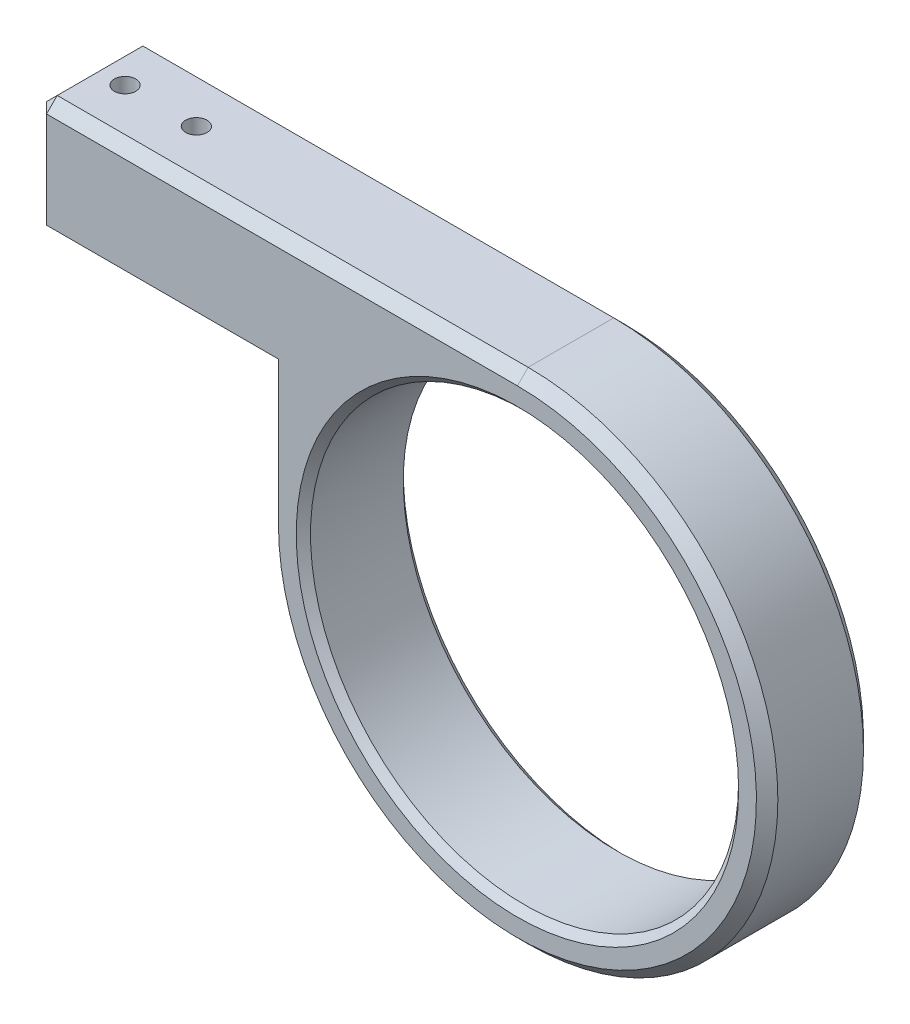
ISO-10303-21;
HEADER;
FILE_DESCRIPTION(('STEP AP214'),'2;1');
FILE_NAME('part.step','',(''),(''),'','','');
FILE_SCHEMA(('AUTOMOTIVE_DESIGN { 1 0 10303 214 1 1 1 1 }'));
ENDSEC;
DATA;
#1=APPLICATION_CONTEXT('core data for automotive mechanical design processes');
#2=APPLICATION_PROTOCOL_DEFINITION('international standard','automotive_design',2000,#1);
#3=PRODUCT_CONTEXT('',#1,'mechanical');
#4=PRODUCT('Part','Part','',(#3));
#5=PRODUCT_RELATED_PRODUCT_CATEGORY('part','',(#4));
#6=PRODUCT_DEFINITION_FORMATION('','',#4);
#7=PRODUCT_DEFINITION_CONTEXT('part definition',#1,'design');
#8=PRODUCT_DEFINITION('design','',#6,#7);
#9=PRODUCT_DEFINITION_SHAPE('','',#8);
#10=(LENGTH_UNIT() NAMED_UNIT(*) SI_UNIT(.MILLI.,.METRE.));
#11=(NAMED_UNIT(*) PLANE_ANGLE_UNIT() SI_UNIT($,.RADIAN.));
#12=(NAMED_UNIT(*) SI_UNIT($,.STERADIAN.) SOLID_ANGLE_UNIT());
#13=UNCERTAINTY_MEASURE_WITH_UNIT(LENGTH_MEASURE(1.E-05),#10,'distance_accuracy_value','');
#14=(GEOMETRIC_REPRESENTATION_CONTEXT(3) GLOBAL_UNCERTAINTY_ASSIGNED_CONTEXT((#13)) GLOBAL_UNIT_ASSIGNED_CONTEXT((#10,
#11,#12)) REPRESENTATION_CONTEXT('',''));
#15=CARTESIAN_POINT('',(0.,0.,0.));
#16=DIRECTION('',(0.,0.,1.));
#17=DIRECTION('',(1.,0.,0.));
#18=AXIS2_PLACEMENT_3D('',#15,#16,#17);
#19=CARTESIAN_POINT('',(0.,0.,15.));
#20=DIRECTION('',(0.,0.,-1.));
#21=DIRECTION('',(-1.,0.,0.));
#22=AXIS2_PLACEMENT_3D('',#19,#20,#21);
#23=CYLINDRICAL_SURFACE('',#22,35.);
#24=DIRECTION('',(0.,0.,1.));
#25=VECTOR('',#24,1.);
#26=CARTESIAN_POINT('',(-35.,0.,15.));
#27=LINE('',#26,#25);
#28=CARTESIAN_POINT('',(-35.,0.,1.49999999999999));
#29=VERTEX_POINT('',#28);
#30=CARTESIAN_POINT('',(-35.,0.,13.5));
#31=VERTEX_POINT('',#30);
#32=EDGE_CURVE('E255',#29,#31,#27,.T.);
#33=ORIENTED_EDGE('',*,*,#32,.F.);
#34=CARTESIAN_POINT('',(0.,0.,1.49999999999999));
#35=DIRECTION('',(0.,0.,1.));
#36=DIRECTION('',(1.,0.,0.));
#37=AXIS2_PLACEMENT_3D('',#34,#35,#36);
#38=CIRCLE('',#37,35.);
#39=CARTESIAN_POINT('',(0.,35.,1.49999999999999));
#40=VERTEX_POINT('',#39);
#41=EDGE_CURVE('E193',#29,#40,#38,.T.);
#42=ORIENTED_EDGE('',*,*,#41,.T.);
#43=DIRECTION('',(0.,0.,-1.));
#44=VECTOR('',#43,1.);
#45=CARTESIAN_POINT('',(0.,35.,15.));
#46=LINE('',#45,#44);
#47=CARTESIAN_POINT('',(0.,35.,13.5));
#48=VERTEX_POINT('',#47);
#49=EDGE_CURVE('E262',#40,#48,#46,.F.);
#50=ORIENTED_EDGE('',*,*,#49,.T.);
#51=CARTESIAN_POINT('',(0.,0.,13.5));
#52=DIRECTION('',(0.,0.,1.));
#53=DIRECTION('',(1.,0.,0.));
#54=AXIS2_PLACEMENT_3D('',#51,#52,#53);
#55=CIRCLE('',#54,35.);
#56=EDGE_CURVE('E56',#48,#31,#55,.F.);
#57=ORIENTED_EDGE('',*,*,#56,.T.);
#58=EDGE_LOOP('',(#33,#42,#50,#57));
#59=FACE_BOUND('',#58,.T.);
#60=ADVANCED_FACE('F38',(#59),#23,.T.);
#61=CARTESIAN_POINT('',(0.,0.,15.));
#62=DIRECTION('',(0.,0.,1.));
#63=DIRECTION('',(1.,0.,0.));
#64=AXIS2_PLACEMENT_3D('',#61,#62,#63);
#65=PLANE('',#64);
#66=CARTESIAN_POINT('',(0.,0.,15.));
#67=DIRECTION('',(0.,0.,1.));
#68=DIRECTION('',(1.,0.,0.));
#69=AXIS2_PLACEMENT_3D('',#66,#67,#68);
#70=CIRCLE('',#69,31.);
#71=CARTESIAN_POINT('',(31.,0.,15.));
#72=VERTEX_POINT('',#71);
#73=EDGE_CURVE('E267',#72,#72,#70,.F.);
#74=ORIENTED_EDGE('',*,*,#73,.T.);
#75=EDGE_LOOP('',(#74));
#76=FACE_BOUND('',#75,.T.);
#77=DIRECTION('',(-1.,0.,0.));
#78=VECTOR('',#77,1.);
#79=CARTESIAN_POINT('',(0.,33.5,15.));
#80=LINE('',#79,#78);
#81=CARTESIAN_POINT('',(0.,33.5,15.));
#82=VERTEX_POINT('',#81);
#83=CARTESIAN_POINT('',(-66.,33.5,15.));
#84=VERTEX_POINT('',#83);
#85=EDGE_CURVE('E290',#82,#84,#80,.T.);
#86=ORIENTED_EDGE('',*,*,#85,.T.);
#87=DIRECTION('',(0.,-1.,0.));
#88=VECTOR('',#87,1.);
#89=CARTESIAN_POINT('',(-66.,0.,15.));
#90=LINE('',#89,#88);
#91=CARTESIAN_POINT('',(-66.,20.,15.));
#92=VERTEX_POINT('',#91);
#93=EDGE_CURVE('E156',#84,#92,#90,.T.);
#94=ORIENTED_EDGE('',*,*,#93,.T.);
#95=DIRECTION('',(-1.,0.,0.));
#96=VECTOR('',#95,1.);
#97=CARTESIAN_POINT('',(35.001,20.,15.));
#98=LINE('',#97,#96);
#99=CARTESIAN_POINT('',(-33.5,20.,15.));
#100=VERTEX_POINT('',#99);
#101=EDGE_CURVE('E259',#100,#92,#98,.T.);
#102=ORIENTED_EDGE('',*,*,#101,.F.);
#103=DIRECTION('',(0.,-1.,0.));
#104=VECTOR('',#103,1.);
#105=CARTESIAN_POINT('',(-33.5,0.,15.));
#106=LINE('',#105,#104);
#107=CARTESIAN_POINT('',(-33.5,0.,15.));
#108=VERTEX_POINT('',#107);
#109=EDGE_CURVE('E162',#100,#108,#106,.T.);
#110=ORIENTED_EDGE('',*,*,#109,.T.);
#111=CARTESIAN_POINT('',(0.,0.,15.));
#112=DIRECTION('',(0.,0.,1.));
#113=DIRECTION('',(1.,0.,0.));
#114=AXIS2_PLACEMENT_3D('',#111,#112,#113);
#115=CIRCLE('',#114,33.5);
#116=EDGE_CURVE('E287',#108,#82,#115,.T.);
#117=ORIENTED_EDGE('',*,*,#116,.T.);
#118=EDGE_LOOP('',(#86,#94,#102,#110,#117));
#119=FACE_BOUND('',#118,.T.);
#120=ADVANCED_FACE('F296',(#76,#119),#65,.T.);
#121=CARTESIAN_POINT('',(0.,0.,0.));
#122=DIRECTION('',(0.,0.,1.));
#123=DIRECTION('',(1.,0.,0.));
#124=AXIS2_PLACEMENT_3D('',#121,#122,#123);
#125=PLANE('',#124);
#126=CARTESIAN_POINT('',(0.,0.,0.));
#127=DIRECTION('',(0.,0.,1.));
#128=DIRECTION('',(1.,0.,0.));
#129=AXIS2_PLACEMENT_3D('',#126,#127,#128);
#130=CIRCLE('',#129,31.);
#131=CARTESIAN_POINT('',(31.,0.,0.));
#132=VERTEX_POINT('',#131);
#133=EDGE_CURVE('E139',#132,#132,#130,.T.);
#134=ORIENTED_EDGE('',*,*,#133,.T.);
#135=EDGE_LOOP('',(#134));
#136=FACE_BOUND('',#135,.T.);
#137=DIRECTION('',(0.,1.,0.));
#138=VECTOR('',#137,1.);
#139=CARTESIAN_POINT('',(-33.5,20.,0.));
#140=LINE('',#139,#138);
#141=CARTESIAN_POINT('',(-33.5,0.,0.));
#142=VERTEX_POINT('',#141);
#143=CARTESIAN_POINT('',(-33.5,20.,0.));
#144=VERTEX_POINT('',#143);
#145=EDGE_CURVE('E180',#142,#144,#140,.T.);
#146=ORIENTED_EDGE('',*,*,#145,.T.);
#147=DIRECTION('',(-1.,0.,0.));
#148=VECTOR('',#147,1.);
#149=CARTESIAN_POINT('',(35.001,20.,0.));
#150=LINE('',#149,#148);
#151=CARTESIAN_POINT('',(-66.,20.,0.));
#152=VERTEX_POINT('',#151);
#153=EDGE_CURVE('E149',#144,#152,#150,.T.);
#154=ORIENTED_EDGE('',*,*,#153,.T.);
#155=DIRECTION('',(0.,1.,0.));
#156=VECTOR('',#155,1.);
#157=CARTESIAN_POINT('',(-66.,35.,0.));
#158=LINE('',#157,#156);
#159=CARTESIAN_POINT('',(-66.,33.5,0.));
#160=VERTEX_POINT('',#159);
#161=EDGE_CURVE('E154',#152,#160,#158,.T.);
#162=ORIENTED_EDGE('',*,*,#161,.T.);
#163=DIRECTION('',(1.,0.,0.));
#164=VECTOR('',#163,1.);
#165=CARTESIAN_POINT('',(0.,33.5,0.));
#166=LINE('',#165,#164);
#167=CARTESIAN_POINT('',(0.,33.5,0.));
#168=VERTEX_POINT('',#167);
#169=EDGE_CURVE('E177',#160,#168,#166,.T.);
#170=ORIENTED_EDGE('',*,*,#169,.T.);
#171=CARTESIAN_POINT('',(0.,0.,0.));
#172=DIRECTION('',(0.,0.,1.));
#173=DIRECTION('',(1.,0.,0.));
#174=AXIS2_PLACEMENT_3D('',#171,#172,#173);
#175=CIRCLE('',#174,33.5);
#176=EDGE_CURVE('E174',#168,#142,#175,.F.);
#177=ORIENTED_EDGE('',*,*,#176,.T.);
#178=EDGE_LOOP('',(#146,#154,#162,#170,#177));
#179=FACE_BOUND('',#178,.T.);
#180=ADVANCED_FACE('F327',(#136,#179),#125,.F.);
#181=CARTESIAN_POINT('',(0.,0.,15.));
#182=DIRECTION('',(0.,0.,-1.));
#183=DIRECTION('',(-1.,0.,0.));
#184=AXIS2_PLACEMENT_3D('',#181,#182,#183);
#185=CYLINDRICAL_SURFACE('',#184,30.);
#186=CARTESIAN_POINT('',(0.,0.,14.));
#187=DIRECTION('',(0.,0.,1.));
#188=DIRECTION('',(1.,0.,0.));
#189=AXIS2_PLACEMENT_3D('',#186,#187,#188);
#190=CIRCLE('',#189,30.);
#191=CARTESIAN_POINT('',(30.,0.,14.));
#192=VERTEX_POINT('',#191);
#193=EDGE_CURVE('E275',#192,#192,#190,.T.);
#194=ORIENTED_EDGE('',*,*,#193,.T.);
#195=EDGE_LOOP('',(#194));
#196=FACE_BOUND('',#195,.T.);
#197=CARTESIAN_POINT('',(0.,0.,0.999999999999997));
#198=DIRECTION('',(0.,0.,1.));
#199=DIRECTION('',(1.,0.,0.));
#200=AXIS2_PLACEMENT_3D('',#197,#198,#199);
#201=CIRCLE('',#200,30.);
#202=CARTESIAN_POINT('',(30.,0.,0.999999999999997));
#203=VERTEX_POINT('',#202);
#204=EDGE_CURVE('E271',#203,#203,#201,.F.);
#205=ORIENTED_EDGE('',*,*,#204,.T.);
#206=EDGE_LOOP('',(#205));
#207=FACE_BOUND('',#206,.T.);
#208=ADVANCED_FACE('F342',(#196,#207),#185,.F.);
#209=CARTESIAN_POINT('',(35.001,20.,15.));
#210=DIRECTION('',(0.,-1.,0.));
#211=DIRECTION('',(0.,0.,-1.));
#212=AXIS2_PLACEMENT_3D('',#209,#210,#211);
#213=PLANE('',#212);
#214=CARTESIAN_POINT('',(-62.5,20.,7.5));
#215=DIRECTION('',(0.,-1.,0.));
#216=DIRECTION('',(0.,0.,-1.));
#217=AXIS2_PLACEMENT_3D('',#214,#215,#216);
#218=CIRCLE('',#217,1.5);
#219=CARTESIAN_POINT('',(-62.5,20.,5.99999999999999));
#220=VERTEX_POINT('',#219);
#221=EDGE_CURVE('E249',#220,#220,#218,.T.);
#222=ORIENTED_EDGE('',*,*,#221,.F.);
#223=EDGE_LOOP('',(#222));
#224=FACE_BOUND('',#223,.T.);
#225=CARTESIAN_POINT('',(-52.5,20.,7.5));
#226=DIRECTION('',(0.,-1.,0.));
#227=DIRECTION('',(0.,0.,-1.));
#228=AXIS2_PLACEMENT_3D('',#225,#226,#227);
#229=CIRCLE('',#228,1.5);
#230=CARTESIAN_POINT('',(-52.5,20.,5.99999999999999));
#231=VERTEX_POINT('',#230);
#232=EDGE_CURVE('E236',#231,#231,#229,.T.);
#233=ORIENTED_EDGE('',*,*,#232,.F.);
#234=EDGE_LOOP('',(#233));
#235=FACE_BOUND('',#234,.T.);
#236=ORIENTED_EDGE('',*,*,#101,.T.);
#237=DIRECTION('',(0.707106781186548,0.,0.707106781186548));
#238=VECTOR('',#237,1.);
#239=CARTESIAN_POINT('',(-15.4995,20.,65.5005));
#240=LINE('',#239,#238);
#241=CARTESIAN_POINT('',(-67.5,20.,13.5));
#242=VERTEX_POINT('',#241);
#243=EDGE_CURVE('E147',#92,#242,#240,.F.);
#244=ORIENTED_EDGE('',*,*,#243,.T.);
#245=DIRECTION('',(0.,0.,1.));
#246=VECTOR('',#245,1.);
#247=CARTESIAN_POINT('',(-67.5,20.,15.));
#248=LINE('',#247,#246);
#249=CARTESIAN_POINT('',(-67.5,20.,1.5));
#250=VERTEX_POINT('',#249);
#251=EDGE_CURVE('E130',#250,#242,#248,.T.);
#252=ORIENTED_EDGE('',*,*,#251,.F.);
#253=DIRECTION('',(0.707106781186548,0.,-0.707106781186548));
#254=VECTOR('',#253,1.);
#255=CARTESIAN_POINT('',(-22.9995,20.,-43.0005));
#256=LINE('',#255,#254);
#257=EDGE_CURVE('E144',#250,#152,#256,.T.);
#258=ORIENTED_EDGE('',*,*,#257,.T.);
#259=ORIENTED_EDGE('',*,*,#153,.F.);
#260=DIRECTION('',(-0.707106781186549,0.,0.707106781186546));
#261=VECTOR('',#260,1.);
#262=CARTESIAN_POINT('',(-35.,20.,1.49999999999998));
#263=LINE('',#262,#261);
#264=CARTESIAN_POINT('',(-35.,20.,1.49999999999999));
#265=VERTEX_POINT('',#264);
#266=EDGE_CURVE('E48',#144,#265,#263,.T.);
#267=ORIENTED_EDGE('',*,*,#266,.T.);
#268=DIRECTION('',(0.,0.,-1.));
#269=VECTOR('',#268,1.);
#270=CARTESIAN_POINT('',(-35.,20.,15.));
#271=LINE('',#270,#269);
#272=CARTESIAN_POINT('',(-35.,20.,13.5));
#273=VERTEX_POINT('',#272);
#274=EDGE_CURVE('E150',#273,#265,#271,.T.);
#275=ORIENTED_EDGE('',*,*,#274,.F.);
#276=DIRECTION('',(-0.707106781186546,0.,-0.707106781186549));
#277=VECTOR('',#276,1.);
#278=CARTESIAN_POINT('',(-35.,20.,13.5));
#279=LINE('',#278,#277);
#280=EDGE_CURVE('E11',#273,#100,#279,.F.);
#281=ORIENTED_EDGE('',*,*,#280,.T.);
#282=EDGE_LOOP('',(#236,#244,#252,#258,#259,#267,#275,#281));
#283=FACE_BOUND('',#282,.T.);
#284=ADVANCED_FACE('F143',(#224,#235,#283),#213,.T.);
#285=CARTESIAN_POINT('',(35.001,35.,15.));
#286=DIRECTION('',(0.,1.,0.));
#287=DIRECTION('',(0.,0.,1.));
#288=AXIS2_PLACEMENT_3D('',#285,#286,#287);
#289=PLANE('',#288);
#290=CARTESIAN_POINT('',(-62.5,35.,7.49999999999999));
#291=DIRECTION('',(0.,-1.,0.));
#292=DIRECTION('',(0.,0.,-1.));
#293=AXIS2_PLACEMENT_3D('',#290,#291,#292);
#294=CIRCLE('',#293,1.5);
#295=CARTESIAN_POINT('',(-62.5,35.,5.99999999999999));
#296=VERTEX_POINT('',#295);
#297=EDGE_CURVE('E257',#296,#296,#294,.T.);
#298=ORIENTED_EDGE('',*,*,#297,.T.);
#299=EDGE_LOOP('',(#298));
#300=FACE_BOUND('',#299,.T.);
#301=CARTESIAN_POINT('',(-52.5,35.,7.49999999999999));
#302=DIRECTION('',(0.,-1.,0.));
#303=DIRECTION('',(0.,0.,-1.));
#304=AXIS2_PLACEMENT_3D('',#301,#302,#303);
#305=CIRCLE('',#304,1.5);
#306=CARTESIAN_POINT('',(-52.5,35.,5.99999999999999));
#307=VERTEX_POINT('',#306);
#308=EDGE_CURVE('E243',#307,#307,#305,.T.);
#309=ORIENTED_EDGE('',*,*,#308,.T.);
#310=EDGE_LOOP('',(#309));
#311=FACE_BOUND('',#310,.T.);
#312=ORIENTED_EDGE('',*,*,#49,.F.);
#313=DIRECTION('',(-1.,0.,0.));
#314=VECTOR('',#313,1.);
#315=CARTESIAN_POINT('',(-67.5,35.,1.49999999999999));
#316=LINE('',#315,#314);
#317=CARTESIAN_POINT('',(-66.,35.,1.49999999999999));
#318=VERTEX_POINT('',#317);
#319=EDGE_CURVE('E171',#40,#318,#316,.T.);
#320=ORIENTED_EDGE('',*,*,#319,.T.);
#321=DIRECTION('',(0.,0.,1.));
#322=VECTOR('',#321,1.);
#323=CARTESIAN_POINT('',(-66.,35.,15.));
#324=LINE('',#323,#322);
#325=CARTESIAN_POINT('',(-66.,35.,13.5));
#326=VERTEX_POINT('',#325);
#327=EDGE_CURVE('E168',#318,#326,#324,.T.);
#328=ORIENTED_EDGE('',*,*,#327,.T.);
#329=DIRECTION('',(1.,0.,0.));
#330=VECTOR('',#329,1.);
#331=CARTESIAN_POINT('',(35.001,35.,13.5));
#332=LINE('',#331,#330);
#333=EDGE_CURVE('E160',#326,#48,#332,.T.);
#334=ORIENTED_EDGE('',*,*,#333,.T.);
#335=EDGE_LOOP('',(#312,#320,#328,#334));
#336=FACE_BOUND('',#335,.T.);
#337=ADVANCED_FACE('F332',(#300,#311,#336),#289,.T.);
#338=CARTESIAN_POINT('',(-67.5,0.,0.));
#339=DIRECTION('',(-1.,0.,0.));
#340=DIRECTION('',(0.,0.,1.));
#341=AXIS2_PLACEMENT_3D('',#338,#339,#340);
#342=PLANE('',#341);
#343=ORIENTED_EDGE('',*,*,#251,.T.);
#344=DIRECTION('',(0.,1.,0.));
#345=VECTOR('',#344,1.);
#346=CARTESIAN_POINT('',(-67.5,0.,13.5));
#347=LINE('',#346,#345);
#348=CARTESIAN_POINT('',(-67.5,33.5,13.5));
#349=VERTEX_POINT('',#348);
#350=EDGE_CURVE('E284',#242,#349,#347,.T.);
#351=ORIENTED_EDGE('',*,*,#350,.T.);
#352=DIRECTION('',(0.,0.,-1.));
#353=VECTOR('',#352,1.);
#354=CARTESIAN_POINT('',(-67.5,33.5,0.));
#355=LINE('',#354,#353);
#356=CARTESIAN_POINT('',(-67.5,33.5,1.5));
#357=VERTEX_POINT('',#356);
#358=EDGE_CURVE('E133',#349,#357,#355,.T.);
#359=ORIENTED_EDGE('',*,*,#358,.T.);
#360=DIRECTION('',(0.,-1.,0.));
#361=VECTOR('',#360,1.);
#362=CARTESIAN_POINT('',(-67.5,20.,1.5));
#363=LINE('',#362,#361);
#364=EDGE_CURVE('E126',#357,#250,#363,.T.);
#365=ORIENTED_EDGE('',*,*,#364,.T.);
#366=EDGE_LOOP('',(#343,#351,#359,#365));
#367=FACE_BOUND('',#366,.T.);
#368=ADVANCED_FACE('F128',(#367),#342,.T.);
#369=CARTESIAN_POINT('',(-35.,0.,0.));
#370=DIRECTION('',(-1.,0.,0.));
#371=DIRECTION('',(0.,0.,1.));
#372=AXIS2_PLACEMENT_3D('',#369,#370,#371);
#373=PLANE('',#372);
#374=ORIENTED_EDGE('',*,*,#274,.T.);
#375=DIRECTION('',(0.,-1.,0.));
#376=VECTOR('',#375,1.);
#377=CARTESIAN_POINT('',(-35.,0.,1.49999999999999));
#378=LINE('',#377,#376);
#379=EDGE_CURVE('E63',#265,#29,#378,.T.);
#380=ORIENTED_EDGE('',*,*,#379,.T.);
#381=ORIENTED_EDGE('',*,*,#32,.T.);
#382=DIRECTION('',(0.,1.,0.));
#383=VECTOR('',#382,1.);
#384=CARTESIAN_POINT('',(-35.,0.,13.5));
#385=LINE('',#384,#383);
#386=EDGE_CURVE('E186',#31,#273,#385,.T.);
#387=ORIENTED_EDGE('',*,*,#386,.T.);
#388=EDGE_LOOP('',(#374,#380,#381,#387));
#389=FACE_BOUND('',#388,.T.);
#390=ADVANCED_FACE('F340',(#389),#373,.T.);
#391=CARTESIAN_POINT('',(-52.5,35.,7.49999999999999));
#392=DIRECTION('',(0.,-1.,0.));
#393=DIRECTION('',(0.,0.,-1.));
#394=AXIS2_PLACEMENT_3D('',#391,#392,#393);
#395=CYLINDRICAL_SURFACE('',#394,1.5);
#396=ORIENTED_EDGE('',*,*,#308,.F.);
#397=EDGE_LOOP('',(#396));
#398=FACE_BOUND('',#397,.T.);
#399=ORIENTED_EDGE('',*,*,#232,.T.);
#400=EDGE_LOOP('',(#399));
#401=FACE_BOUND('',#400,.T.);
#402=ADVANCED_FACE('F392',(#398,#401),#395,.F.);
#403=CARTESIAN_POINT('',(-62.5,35.,7.49999999999999));
#404=DIRECTION('',(0.,-1.,0.));
#405=DIRECTION('',(0.,0.,-1.));
#406=AXIS2_PLACEMENT_3D('',#403,#404,#405);
#407=CYLINDRICAL_SURFACE('',#406,1.5);
#408=ORIENTED_EDGE('',*,*,#297,.F.);
#409=EDGE_LOOP('',(#408));
#410=FACE_BOUND('',#409,.T.);
#411=ORIENTED_EDGE('',*,*,#221,.T.);
#412=EDGE_LOOP('',(#411));
#413=FACE_BOUND('',#412,.T.);
#414=ADVANCED_FACE('F361',(#410,#413),#407,.F.);
#415=CARTESIAN_POINT('',(0.,0.,15.));
#416=DIRECTION('',(0.,0.,1.));
#417=DIRECTION('',(1.,0.,0.));
#418=AXIS2_PLACEMENT_3D('',#415,#416,#417);
#419=CONICAL_SURFACE('',#418,31.,0.785398163397447);
#420=ORIENTED_EDGE('',*,*,#193,.F.);
#421=EDGE_LOOP('',(#420));
#422=FACE_BOUND('',#421,.T.);
#423=ORIENTED_EDGE('',*,*,#73,.F.);
#424=EDGE_LOOP('',(#423));
#425=FACE_BOUND('',#424,.T.);
#426=ADVANCED_FACE('F357',(#422,#425),#419,.F.);
#427=CARTESIAN_POINT('',(0.,0.,0.999999999999997));
#428=DIRECTION('',(0.,0.,-1.));
#429=DIRECTION('',(-1.,0.,0.));
#430=AXIS2_PLACEMENT_3D('',#427,#428,#429);
#431=CONICAL_SURFACE('',#430,30.,0.785398163397445);
#432=ORIENTED_EDGE('',*,*,#133,.F.);
#433=EDGE_LOOP('',(#432));
#434=FACE_BOUND('',#433,.T.);
#435=ORIENTED_EDGE('',*,*,#204,.F.);
#436=EDGE_LOOP('',(#435));
#437=FACE_BOUND('',#436,.T.);
#438=ADVANCED_FACE('F360',(#434,#437),#431,.F.);
#439=CARTESIAN_POINT('',(-35.,0.,1.49999999999999));
#440=DIRECTION('',(-0.707106781186546,0.,-0.707106781186549));
#441=DIRECTION('',(0.,1.,0.));
#442=AXIS2_PLACEMENT_3D('',#439,#440,#441);
#443=PLANE('',#442);
#444=ORIENTED_EDGE('',*,*,#266,.F.);
#445=ORIENTED_EDGE('',*,*,#145,.F.);
#446=DIRECTION('',(0.707106781186549,0.,-0.707106781186546));
#447=VECTOR('',#446,1.);
#448=CARTESIAN_POINT('',(-35.,0.,1.49999999999999));
#449=LINE('',#448,#447);
#450=EDGE_CURVE('E42',#29,#142,#449,.T.);
#451=ORIENTED_EDGE('',*,*,#450,.F.);
#452=ORIENTED_EDGE('',*,*,#379,.F.);
#453=EDGE_LOOP('',(#444,#445,#451,#452));
#454=FACE_BOUND('',#453,.T.);
#455=ADVANCED_FACE('F40',(#454),#443,.T.);
#456=CARTESIAN_POINT('',(0.,0.,1.49999999999999));
#457=DIRECTION('',(0.,0.,1.));
#458=DIRECTION('',(1.,0.,0.));
#459=AXIS2_PLACEMENT_3D('',#456,#457,#458);
#460=CONICAL_SURFACE('',#459,35.,0.785398163397451);
#461=ORIENTED_EDGE('',*,*,#450,.T.);
#462=ORIENTED_EDGE('',*,*,#176,.F.);
#463=DIRECTION('',(0.,-0.707106781186549,-0.707106781186546));
#464=VECTOR('',#463,1.);
#465=CARTESIAN_POINT('',(0.,35.,1.49999999999999));
#466=LINE('',#465,#464);
#467=EDGE_CURVE('E227',#40,#168,#466,.T.);
#468=ORIENTED_EDGE('',*,*,#467,.F.);
#469=ORIENTED_EDGE('',*,*,#41,.F.);
#470=EDGE_LOOP('',(#461,#462,#468,#469));
#471=FACE_BOUND('',#470,.T.);
#472=ADVANCED_FACE('F329',(#471),#460,.T.);
#473=CARTESIAN_POINT('',(-67.5,0.,1.5));
#474=DIRECTION('',(-0.707106781186547,0.,-0.707106781186547));
#475=DIRECTION('',(0.,1.,0.));
#476=AXIS2_PLACEMENT_3D('',#473,#474,#475);
#477=PLANE('',#476);
#478=ORIENTED_EDGE('',*,*,#257,.F.);
#479=ORIENTED_EDGE('',*,*,#364,.F.);
#480=DIRECTION('',(-0.707106781186548,0.,0.707106781186548));
#481=VECTOR('',#480,1.);
#482=CARTESIAN_POINT('',(-67.5,33.5,1.5));
#483=LINE('',#482,#481);
#484=EDGE_CURVE('E225',#160,#357,#483,.T.);
#485=ORIENTED_EDGE('',*,*,#484,.F.);
#486=ORIENTED_EDGE('',*,*,#161,.F.);
#487=EDGE_LOOP('',(#478,#479,#485,#486));
#488=FACE_BOUND('',#487,.T.);
#489=ADVANCED_FACE('F153',(#488),#477,.T.);
#490=CARTESIAN_POINT('',(35.001,35.,1.49999999999999));
#491=DIRECTION('',(0.,0.707106781186546,-0.707106781186549));
#492=DIRECTION('',(1.,0.,0.));
#493=AXIS2_PLACEMENT_3D('',#490,#491,#492);
#494=PLANE('',#493);
#495=ORIENTED_EDGE('',*,*,#467,.T.);
#496=ORIENTED_EDGE('',*,*,#169,.F.);
#497=DIRECTION('',(0.,-0.707106781186549,-0.707106781186546));
#498=VECTOR('',#497,1.);
#499=CARTESIAN_POINT('',(-66.,34.25,0.749999999999994));
#500=LINE('',#499,#498);
#501=EDGE_CURVE('E221',#318,#160,#500,.T.);
#502=ORIENTED_EDGE('',*,*,#501,.F.);
#503=ORIENTED_EDGE('',*,*,#319,.F.);
#504=EDGE_LOOP('',(#495,#496,#502,#503));
#505=FACE_BOUND('',#504,.T.);
#506=ADVANCED_FACE('F325',(#505),#494,.T.);
#507=CARTESIAN_POINT('',(-35.,0.,13.5));
#508=DIRECTION('',(0.707106781186549,0.,-0.707106781186546));
#509=DIRECTION('',(0.,1.,0.));
#510=AXIS2_PLACEMENT_3D('',#507,#508,#509);
#511=PLANE('',#510);
#512=ORIENTED_EDGE('',*,*,#280,.F.);
#513=ORIENTED_EDGE('',*,*,#386,.F.);
#514=DIRECTION('',(-0.707106781186546,0.,-0.707106781186549));
#515=VECTOR('',#514,1.);
#516=CARTESIAN_POINT('',(-33.5,0.,15.));
#517=LINE('',#516,#515);
#518=EDGE_CURVE('E217',#108,#31,#517,.T.);
#519=ORIENTED_EDGE('',*,*,#518,.F.);
#520=ORIENTED_EDGE('',*,*,#109,.F.);
#521=EDGE_LOOP('',(#512,#513,#519,#520));
#522=FACE_BOUND('',#521,.T.);
#523=ADVANCED_FACE('F302',(#522),#511,.F.);
#524=CARTESIAN_POINT('',(-67.5,33.5,1.5));
#525=DIRECTION('',(-0.577350269189628,0.577350269189623,-0.577350269189626));
#526=DIRECTION('',(-0.707106781186546,0.,0.707106781186549));
#527=AXIS2_PLACEMENT_3D('',#524,#525,#526);
#528=PLANE('',#527);
#529=ORIENTED_EDGE('',*,*,#501,.T.);
#530=ORIENTED_EDGE('',*,*,#484,.T.);
#531=DIRECTION('',(-0.707106781186547,-0.707106781186547,0.));
#532=VECTOR('',#531,1.);
#533=CARTESIAN_POINT('',(-67.5,33.5,1.5));
#534=LINE('',#533,#532);
#535=EDGE_CURVE('E213',#318,#357,#534,.T.);
#536=ORIENTED_EDGE('',*,*,#535,.F.);
#537=EDGE_LOOP('',(#529,#530,#536));
#538=FACE_BOUND('',#537,.T.);
#539=ADVANCED_FACE('F323',(#538),#528,.T.);
#540=CARTESIAN_POINT('',(0.,0.,15.));
#541=DIRECTION('',(0.,0.,-1.));
#542=DIRECTION('',(-1.,0.,0.));
#543=AXIS2_PLACEMENT_3D('',#540,#541,#542);
#544=CONICAL_SURFACE('',#543,33.5,0.785398163397446);
#545=ORIENTED_EDGE('',*,*,#518,.T.);
#546=ORIENTED_EDGE('',*,*,#56,.F.);
#547=DIRECTION('',(0.,0.707106781186546,-0.707106781186549));
#548=VECTOR('',#547,1.);
#549=CARTESIAN_POINT('',(0.,33.5,15.));
#550=LINE('',#549,#548);
#551=EDGE_CURVE('E209',#82,#48,#550,.T.);
#552=ORIENTED_EDGE('',*,*,#551,.F.);
#553=ORIENTED_EDGE('',*,*,#116,.F.);
#554=EDGE_LOOP('',(#545,#546,#552,#553));
#555=FACE_BOUND('',#554,.T.);
#556=ADVANCED_FACE('F304',(#555),#544,.T.);
#557=CARTESIAN_POINT('',(-67.5,33.5,0.));
#558=DIRECTION('',(0.707106781186547,-0.707106781186547,0.));
#559=DIRECTION('',(0.,0.,-1.));
#560=AXIS2_PLACEMENT_3D('',#557,#558,#559);
#561=PLANE('',#560);
#562=ORIENTED_EDGE('',*,*,#535,.T.);
#563=ORIENTED_EDGE('',*,*,#358,.F.);
#564=DIRECTION('',(0.707106781186547,0.707106781186547,0.));
#565=VECTOR('',#564,1.);
#566=CARTESIAN_POINT('',(-67.5,33.5,13.5));
#567=LINE('',#566,#565);
#568=EDGE_CURVE('E205',#326,#349,#567,.F.);
#569=ORIENTED_EDGE('',*,*,#568,.F.);
#570=ORIENTED_EDGE('',*,*,#327,.F.);
#571=EDGE_LOOP('',(#562,#563,#569,#570));
#572=FACE_BOUND('',#571,.T.);
#573=ADVANCED_FACE('F320',(#572),#561,.F.);
#574=CARTESIAN_POINT('',(0.,33.5,15.));
#575=DIRECTION('',(0.,-0.707106781186549,-0.707106781186546));
#576=DIRECTION('',(-1.,0.,0.));
#577=AXIS2_PLACEMENT_3D('',#574,#575,#576);
#578=PLANE('',#577);
#579=ORIENTED_EDGE('',*,*,#551,.T.);
#580=ORIENTED_EDGE('',*,*,#333,.F.);
#581=DIRECTION('',(0.,-0.707106781186546,0.707106781186549));
#582=VECTOR('',#581,1.);
#583=CARTESIAN_POINT('',(-66.,34.25,14.25));
#584=LINE('',#583,#582);
#585=EDGE_CURVE('E201',#84,#326,#584,.F.);
#586=ORIENTED_EDGE('',*,*,#585,.F.);
#587=ORIENTED_EDGE('',*,*,#85,.F.);
#588=EDGE_LOOP('',(#579,#580,#586,#587));
#589=FACE_BOUND('',#588,.T.);
#590=ADVANCED_FACE('F309',(#589),#578,.F.);
#591=CARTESIAN_POINT('',(-67.5,33.5,13.5));
#592=DIRECTION('',(-0.577350269189621,0.577350269189629,0.577350269189627));
#593=DIRECTION('',(0.,-0.707106781186546,0.707106781186549));
#594=AXIS2_PLACEMENT_3D('',#591,#592,#593);
#595=PLANE('',#594);
#596=ORIENTED_EDGE('',*,*,#585,.T.);
#597=ORIENTED_EDGE('',*,*,#568,.T.);
#598=DIRECTION('',(-0.707106781186548,0.,-0.707106781186548));
#599=VECTOR('',#598,1.);
#600=CARTESIAN_POINT('',(-67.5,33.5,13.5));
#601=LINE('',#600,#599);
#602=EDGE_CURVE('E198',#84,#349,#601,.T.);
#603=ORIENTED_EDGE('',*,*,#602,.F.);
#604=EDGE_LOOP('',(#596,#597,#603));
#605=FACE_BOUND('',#604,.T.);
#606=ADVANCED_FACE('F317',(#605),#595,.T.);
#607=CARTESIAN_POINT('',(-67.5,0.,13.5));
#608=DIRECTION('',(0.707106781186547,0.,-0.707106781186547));
#609=DIRECTION('',(0.,1.,0.));
#610=AXIS2_PLACEMENT_3D('',#607,#608,#609);
#611=PLANE('',#610);
#612=ORIENTED_EDGE('',*,*,#243,.F.);
#613=ORIENTED_EDGE('',*,*,#93,.F.);
#614=ORIENTED_EDGE('',*,*,#602,.T.);
#615=ORIENTED_EDGE('',*,*,#350,.F.);
#616=EDGE_LOOP('',(#612,#613,#614,#615));
#617=FACE_BOUND('',#616,.T.);
#618=ADVANCED_FACE('F314',(#617),#611,.F.);
#619=CLOSED_SHELL('',(#60,#120,#180,#208,#284,#337,#368,#390,#402,#414,#426,#438,#455,#472,#489,
#506,#523,#539,#556,#573,#590,#606,#618));
#620=MANIFOLD_SOLID_BREP('B2',#619);
#621=ADVANCED_BREP_SHAPE_REPRESENTATION('',(#18,#620),#14);
#622=SHAPE_DEFINITION_REPRESENTATION(#9,#621);
ENDSEC;
END-ISO-10303-21;
